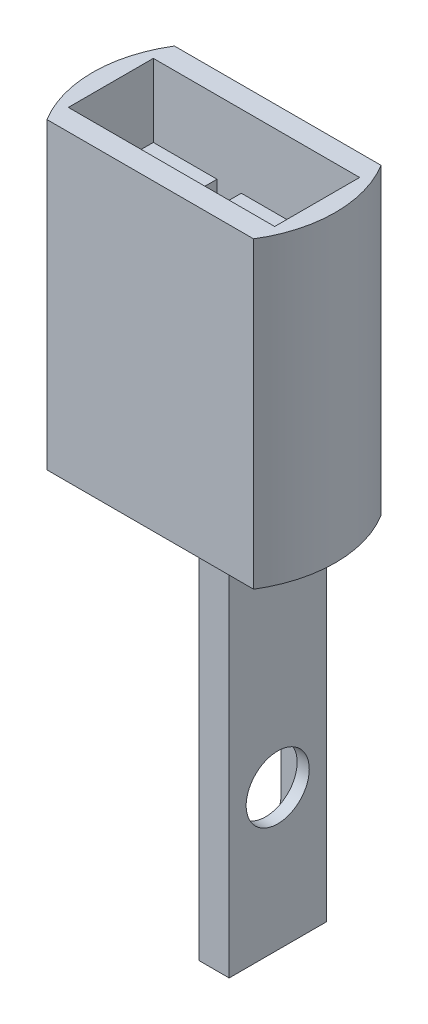
ISO-10303-21;
HEADER;
FILE_DESCRIPTION(('STEP AP214'),'2;1');
FILE_NAME('part.step','',(''),(''),'','','');
FILE_SCHEMA(('AUTOMOTIVE_DESIGN { 1 0 10303 214 1 1 1 1 }'));
ENDSEC;
DATA;
#1=APPLICATION_CONTEXT('core data for automotive mechanical design processes');
#2=APPLICATION_PROTOCOL_DEFINITION('international standard','automotive_design',2000,#1);
#3=PRODUCT_CONTEXT('',#1,'mechanical');
#4=PRODUCT('Part','Part','',(#3));
#5=PRODUCT_RELATED_PRODUCT_CATEGORY('part','',(#4));
#6=PRODUCT_DEFINITION_FORMATION('','',#4);
#7=PRODUCT_DEFINITION_CONTEXT('part definition',#1,'design');
#8=PRODUCT_DEFINITION('design','',#6,#7);
#9=PRODUCT_DEFINITION_SHAPE('','',#8);
#10=(LENGTH_UNIT() NAMED_UNIT(*) SI_UNIT(.MILLI.,.METRE.));
#11=(NAMED_UNIT(*) PLANE_ANGLE_UNIT() SI_UNIT($,.RADIAN.));
#12=(NAMED_UNIT(*) SI_UNIT($,.STERADIAN.) SOLID_ANGLE_UNIT());
#13=UNCERTAINTY_MEASURE_WITH_UNIT(LENGTH_MEASURE(1.E-05),#10,'distance_accuracy_value','');
#14=(GEOMETRIC_REPRESENTATION_CONTEXT(3) GLOBAL_UNCERTAINTY_ASSIGNED_CONTEXT((#13)) GLOBAL_UNIT_ASSIGNED_CONTEXT((#10,
#11,#12)) REPRESENTATION_CONTEXT('',''));
#15=CARTESIAN_POINT('',(0.,0.,0.));
#16=DIRECTION('',(0.,0.,1.));
#17=DIRECTION('',(1.,0.,0.));
#18=AXIS2_PLACEMENT_3D('',#15,#16,#17);
#19=CARTESIAN_POINT('',(0.,25.,0.));
#20=DIRECTION('',(0.,-1.,0.));
#21=DIRECTION('',(0.,0.,-1.));
#22=AXIS2_PLACEMENT_3D('',#19,#20,#21);
#23=CYLINDRICAL_SURFACE('',#22,10.);
#24=CARTESIAN_POINT('',(0.,25.,0.));
#25=DIRECTION('',(0.,1.,0.));
#26=DIRECTION('',(0.,0.,1.));
#27=AXIS2_PLACEMENT_3D('',#24,#25,#26);
#28=CIRCLE('',#27,10.);
#29=CARTESIAN_POINT('',(-8.5110222652746,25.,-5.25));
#30=VERTEX_POINT('',#29);
#31=CARTESIAN_POINT('',(-8.5110222652746,25.,5.25));
#32=VERTEX_POINT('',#31);
#33=EDGE_CURVE('E42',#30,#32,#28,.T.);
#34=ORIENTED_EDGE('',*,*,#33,.F.);
#35=DIRECTION('',(0.,-1.,0.));
#36=VECTOR('',#35,1.);
#37=CARTESIAN_POINT('',(-8.5110222652746,25.001,-5.25));
#38=LINE('',#37,#36);
#39=CARTESIAN_POINT('',(-8.5110222652746,0.,-5.25));
#40=VERTEX_POINT('',#39);
#41=EDGE_CURVE('E50',#30,#40,#38,.T.);
#42=ORIENTED_EDGE('',*,*,#41,.T.);
#43=CARTESIAN_POINT('',(0.,0.,0.));
#44=DIRECTION('',(0.,1.,0.));
#45=DIRECTION('',(0.,0.,1.));
#46=AXIS2_PLACEMENT_3D('',#43,#44,#45);
#47=CIRCLE('',#46,10.);
#48=CARTESIAN_POINT('',(-8.5110222652746,0.,5.25));
#49=VERTEX_POINT('',#48);
#50=EDGE_CURVE('E378',#40,#49,#47,.T.);
#51=ORIENTED_EDGE('',*,*,#50,.T.);
#52=DIRECTION('',(0.,-1.,0.));
#53=VECTOR('',#52,1.);
#54=CARTESIAN_POINT('',(-8.5110222652746,25.001,5.25));
#55=LINE('',#54,#53);
#56=EDGE_CURVE('E216',#32,#49,#55,.T.);
#57=ORIENTED_EDGE('',*,*,#56,.F.);
#58=EDGE_LOOP('',(#34,#42,#51,#57));
#59=FACE_BOUND('',#58,.T.);
#60=ADVANCED_FACE('F33',(#59),#23,.T.);
#61=CARTESIAN_POINT('',(4.25,0.,0.));
#62=DIRECTION('',(1.,0.,0.));
#63=DIRECTION('',(0.,0.,-1.));
#64=AXIS2_PLACEMENT_3D('',#61,#62,#63);
#65=PLANE('',#64);
#66=CARTESIAN_POINT('',(4.25,-18.4,0.));
#67=DIRECTION('',(1.,0.,0.));
#68=DIRECTION('',(0.,0.,-1.));
#69=AXIS2_PLACEMENT_3D('',#66,#67,#68);
#70=CIRCLE('',#69,2.6);
#71=CARTESIAN_POINT('',(4.25,-18.4,-2.6));
#72=VERTEX_POINT('',#71);
#73=EDGE_CURVE('E37',#72,#72,#70,.F.);
#74=ORIENTED_EDGE('',*,*,#73,.F.);
#75=EDGE_LOOP('',(#74));
#76=FACE_BOUND('',#75,.T.);
#77=DIRECTION('',(0.,0.984427575508482,0.175790638483658));
#78=VECTOR('',#77,1.);
#79=CARTESIAN_POINT('',(4.25,-14.9,-2.75));
#80=LINE('',#79,#78);
#81=CARTESIAN_POINT('',(4.25,-14.9,-2.75));
#82=VERTEX_POINT('',#81);
#83=CARTESIAN_POINT('',(4.25,-7.89999999999996,-1.5));
#84=VERTEX_POINT('',#83);
#85=EDGE_CURVE('E201',#82,#84,#80,.T.);
#86=ORIENTED_EDGE('',*,*,#85,.F.);
#87=DIRECTION('',(0.,-1.,0.));
#88=VECTOR('',#87,1.);
#89=CARTESIAN_POINT('',(4.25,-28.9,-2.75));
#90=LINE('',#89,#88);
#91=CARTESIAN_POINT('',(4.25,-21.9,-2.75));
#92=VERTEX_POINT('',#91);
#93=EDGE_CURVE('E332',#82,#92,#90,.T.);
#94=ORIENTED_EDGE('',*,*,#93,.T.);
#95=DIRECTION('',(0.,0.984427575508482,-0.175790638483658));
#96=VECTOR('',#95,1.);
#97=CARTESIAN_POINT('',(4.25,-21.9,-2.75));
#98=LINE('',#97,#96);
#99=CARTESIAN_POINT('',(4.25,-28.9,-1.5));
#100=VERTEX_POINT('',#99);
#101=EDGE_CURVE('E245',#100,#92,#98,.T.);
#102=ORIENTED_EDGE('',*,*,#101,.F.);
#103=DIRECTION('',(0.,0.,1.));
#104=VECTOR('',#103,1.);
#105=CARTESIAN_POINT('',(4.25,-28.9,-2.75));
#106=LINE('',#105,#104);
#107=CARTESIAN_POINT('',(4.25,-28.9,1.5));
#108=VERTEX_POINT('',#107);
#109=EDGE_CURVE('E334',#100,#108,#106,.T.);
#110=ORIENTED_EDGE('',*,*,#109,.T.);
#111=DIRECTION('',(0.,-0.984427575508482,-0.175790638483658));
#112=VECTOR('',#111,1.);
#113=CARTESIAN_POINT('',(4.25,-21.9,2.75));
#114=LINE('',#113,#112);
#115=CARTESIAN_POINT('',(4.25,-21.9,2.75));
#116=VERTEX_POINT('',#115);
#117=EDGE_CURVE('E234',#116,#108,#114,.T.);
#118=ORIENTED_EDGE('',*,*,#117,.F.);
#119=DIRECTION('',(0.,1.,0.));
#120=VECTOR('',#119,1.);
#121=CARTESIAN_POINT('',(4.25,-28.9,2.75));
#122=LINE('',#121,#120);
#123=CARTESIAN_POINT('',(4.25,-14.9,2.75));
#124=VERTEX_POINT('',#123);
#125=EDGE_CURVE('E325',#116,#124,#122,.T.);
#126=ORIENTED_EDGE('',*,*,#125,.T.);
#127=DIRECTION('',(0.,-0.984427575508482,0.175790638483658));
#128=VECTOR('',#127,1.);
#129=CARTESIAN_POINT('',(4.25,-14.9,2.75));
#130=LINE('',#129,#128);
#131=CARTESIAN_POINT('',(4.25,-7.89999999999996,1.5));
#132=VERTEX_POINT('',#131);
#133=EDGE_CURVE('E223',#132,#124,#130,.T.);
#134=ORIENTED_EDGE('',*,*,#133,.F.);
#135=DIRECTION('',(0.,0.,-1.));
#136=VECTOR('',#135,1.);
#137=CARTESIAN_POINT('',(4.25,-7.89999999999996,-2.75));
#138=LINE('',#137,#136);
#139=EDGE_CURVE('E328',#132,#84,#138,.T.);
#140=ORIENTED_EDGE('',*,*,#139,.T.);
#141=EDGE_LOOP('',(#86,#94,#102,#110,#118,#126,#134,#140));
#142=FACE_BOUND('',#141,.T.);
#143=ADVANCED_FACE('F402',(#76,#142),#65,.F.);
#144=CARTESIAN_POINT('',(4.25,-7.89999999999996,-2.75));
#145=DIRECTION('',(0.,1.,0.));
#146=DIRECTION('',(0.,0.,1.));
#147=AXIS2_PLACEMENT_3D('',#144,#145,#146);
#148=PLANE('',#147);
#149=DIRECTION('',(1.,0.,0.));
#150=VECTOR('',#149,1.);
#151=CARTESIAN_POINT('',(-4.36073132666395,-7.89999999999996,-1.5));
#152=LINE('',#151,#150);
#153=CARTESIAN_POINT('',(2.75,-7.89999999999996,-1.5));
#154=VERTEX_POINT('',#153);
#155=EDGE_CURVE('E224',#154,#84,#152,.T.);
#156=ORIENTED_EDGE('',*,*,#155,.T.);
#157=ORIENTED_EDGE('',*,*,#139,.F.);
#158=DIRECTION('',(1.,0.,0.));
#159=VECTOR('',#158,1.);
#160=CARTESIAN_POINT('',(-4.36073132666395,-7.89999999999996,1.5));
#161=LINE('',#160,#159);
#162=CARTESIAN_POINT('',(2.75,-7.89999999999996,1.5));
#163=VERTEX_POINT('',#162);
#164=EDGE_CURVE('E235',#163,#132,#161,.T.);
#165=ORIENTED_EDGE('',*,*,#164,.F.);
#166=DIRECTION('',(0.,0.,-1.));
#167=VECTOR('',#166,1.);
#168=CARTESIAN_POINT('',(2.75,-7.89999999999996,-2.75));
#169=LINE('',#168,#167);
#170=EDGE_CURVE('E338',#163,#154,#169,.T.);
#171=ORIENTED_EDGE('',*,*,#170,.T.);
#172=EDGE_LOOP('',(#156,#157,#165,#171));
#173=FACE_BOUND('',#172,.T.);
#174=ADVANCED_FACE('F406',(#173),#148,.F.);
#175=CARTESIAN_POINT('',(4.25,-28.9,-2.75));
#176=DIRECTION('',(0.,0.,-1.));
#177=DIRECTION('',(-1.,0.,0.));
#178=AXIS2_PLACEMENT_3D('',#175,#176,#177);
#179=PLANE('',#178);
#180=DIRECTION('',(1.,0.,0.));
#181=VECTOR('',#180,1.);
#182=CARTESIAN_POINT('',(-4.36073132666394,-14.9,-2.75));
#183=LINE('',#182,#181);
#184=CARTESIAN_POINT('',(2.75,-14.8999999999999,-2.75));
#185=VERTEX_POINT('',#184);
#186=EDGE_CURVE('E227',#185,#82,#183,.T.);
#187=ORIENTED_EDGE('',*,*,#186,.F.);
#188=DIRECTION('',(0.,-1.,0.));
#189=VECTOR('',#188,1.);
#190=CARTESIAN_POINT('',(2.75,-28.9,-2.75));
#191=LINE('',#190,#189);
#192=CARTESIAN_POINT('',(2.75,-21.9,-2.75));
#193=VERTEX_POINT('',#192);
#194=EDGE_CURVE('E340',#185,#193,#191,.T.);
#195=ORIENTED_EDGE('',*,*,#194,.T.);
#196=DIRECTION('',(1.,0.,0.));
#197=VECTOR('',#196,1.);
#198=CARTESIAN_POINT('',(-4.36073132666394,-21.9,-2.75));
#199=LINE('',#198,#197);
#200=EDGE_CURVE('E260',#193,#92,#199,.T.);
#201=ORIENTED_EDGE('',*,*,#200,.T.);
#202=ORIENTED_EDGE('',*,*,#93,.F.);
#203=EDGE_LOOP('',(#187,#195,#201,#202));
#204=FACE_BOUND('',#203,.T.);
#205=ADVANCED_FACE('F452',(#204),#179,.F.);
#206=CARTESIAN_POINT('',(4.25,-28.9,2.75));
#207=DIRECTION('',(0.,0.,1.));
#208=DIRECTION('',(1.,0.,0.));
#209=AXIS2_PLACEMENT_3D('',#206,#207,#208);
#210=PLANE('',#209);
#211=DIRECTION('',(1.,0.,0.));
#212=VECTOR('',#211,1.);
#213=CARTESIAN_POINT('',(-4.36073132666395,-14.9,2.75));
#214=LINE('',#213,#212);
#215=CARTESIAN_POINT('',(2.75,-14.8999999999999,2.75));
#216=VERTEX_POINT('',#215);
#217=EDGE_CURVE('E238',#216,#124,#214,.T.);
#218=ORIENTED_EDGE('',*,*,#217,.T.);
#219=ORIENTED_EDGE('',*,*,#125,.F.);
#220=DIRECTION('',(1.,0.,0.));
#221=VECTOR('',#220,1.);
#222=CARTESIAN_POINT('',(-4.36073132666395,-21.9,2.75));
#223=LINE('',#222,#221);
#224=CARTESIAN_POINT('',(2.75,-21.9,2.75));
#225=VERTEX_POINT('',#224);
#226=EDGE_CURVE('E249',#225,#116,#223,.T.);
#227=ORIENTED_EDGE('',*,*,#226,.F.);
#228=DIRECTION('',(0.,1.,0.));
#229=VECTOR('',#228,1.);
#230=CARTESIAN_POINT('',(2.75,-28.9,2.75));
#231=LINE('',#230,#229);
#232=EDGE_CURVE('E318',#225,#216,#231,.T.);
#233=ORIENTED_EDGE('',*,*,#232,.T.);
#234=EDGE_LOOP('',(#218,#219,#227,#233));
#235=FACE_BOUND('',#234,.T.);
#236=ADVANCED_FACE('F448',(#235),#210,.F.);
#237=CARTESIAN_POINT('',(4.25,-28.9,-2.75));
#238=DIRECTION('',(0.,-1.,0.));
#239=DIRECTION('',(0.,0.,-1.));
#240=AXIS2_PLACEMENT_3D('',#237,#238,#239);
#241=PLANE('',#240);
#242=DIRECTION('',(1.,0.,0.));
#243=VECTOR('',#242,1.);
#244=CARTESIAN_POINT('',(-4.36073132666395,-28.9,1.5));
#245=LINE('',#244,#243);
#246=CARTESIAN_POINT('',(2.75,-28.9,1.5));
#247=VERTEX_POINT('',#246);
#248=EDGE_CURVE('E246',#247,#108,#245,.T.);
#249=ORIENTED_EDGE('',*,*,#248,.T.);
#250=ORIENTED_EDGE('',*,*,#109,.F.);
#251=DIRECTION('',(1.,0.,0.));
#252=VECTOR('',#251,1.);
#253=CARTESIAN_POINT('',(-4.36073132666395,-28.9,-1.5));
#254=LINE('',#253,#252);
#255=CARTESIAN_POINT('',(2.75,-28.9,-1.5));
#256=VERTEX_POINT('',#255);
#257=EDGE_CURVE('E257',#256,#100,#254,.T.);
#258=ORIENTED_EDGE('',*,*,#257,.F.);
#259=DIRECTION('',(0.,0.,1.));
#260=VECTOR('',#259,1.);
#261=CARTESIAN_POINT('',(2.75,-28.9,-2.75));
#262=LINE('',#261,#260);
#263=EDGE_CURVE('E329',#256,#247,#262,.T.);
#264=ORIENTED_EDGE('',*,*,#263,.T.);
#265=EDGE_LOOP('',(#249,#250,#258,#264));
#266=FACE_BOUND('',#265,.T.);
#267=ADVANCED_FACE('F451',(#266),#241,.F.);
#268=CARTESIAN_POINT('',(0.,19.,0.));
#269=DIRECTION('',(0.,-1.,0.));
#270=DIRECTION('',(0.,0.,-1.));
#271=AXIS2_PLACEMENT_3D('',#268,#269,#270);
#272=PLANE('',#271);
#273=DIRECTION('',(0.,0.,-1.));
#274=VECTOR('',#273,1.);
#275=CARTESIAN_POINT('',(-1.25,19.,-3.5));
#276=LINE('',#275,#274);
#277=CARTESIAN_POINT('',(-1.25,19.,3.5));
#278=VERTEX_POINT('',#277);
#279=CARTESIAN_POINT('',(-1.25,19.,-3.5));
#280=VERTEX_POINT('',#279);
#281=EDGE_CURVE('E256',#278,#280,#276,.T.);
#282=ORIENTED_EDGE('',*,*,#281,.F.);
#283=DIRECTION('',(1.,0.,0.));
#284=VECTOR('',#283,1.);
#285=CARTESIAN_POINT('',(-8.5,19.,3.5));
#286=LINE('',#285,#284);
#287=CARTESIAN_POINT('',(8.5,19.,3.5));
#288=VERTEX_POINT('',#287);
#289=EDGE_CURVE('E294',#278,#288,#286,.T.);
#290=ORIENTED_EDGE('',*,*,#289,.T.);
#291=DIRECTION('',(0.,0.,-1.));
#292=VECTOR('',#291,1.);
#293=CARTESIAN_POINT('',(8.5,19.,3.5));
#294=LINE('',#293,#292);
#295=CARTESIAN_POINT('',(8.5,19.,-3.5));
#296=VERTEX_POINT('',#295);
#297=EDGE_CURVE('E299',#288,#296,#294,.T.);
#298=ORIENTED_EDGE('',*,*,#297,.T.);
#299=DIRECTION('',(-1.,0.,0.));
#300=VECTOR('',#299,1.);
#301=CARTESIAN_POINT('',(-8.5,19.,-3.5));
#302=LINE('',#301,#300);
#303=EDGE_CURVE('E303',#296,#280,#302,.T.);
#304=ORIENTED_EDGE('',*,*,#303,.T.);
#305=EDGE_LOOP('',(#282,#290,#298,#304));
#306=FACE_BOUND('',#305,.T.);
#307=ADVANCED_FACE('F420',(#306),#272,.F.);
#308=DIRECTION('',(0.,0.,1.));
#309=VECTOR('',#308,1.);
#310=CARTESIAN_POINT('',(-3.25,19.,-3.5));
#311=LINE('',#310,#309);
#312=CARTESIAN_POINT('',(-3.25,19.,-3.5));
#313=VERTEX_POINT('',#312);
#314=CARTESIAN_POINT('',(-3.25,19.,3.5));
#315=VERTEX_POINT('',#314);
#316=EDGE_CURVE('E269',#313,#315,#311,.T.);
#317=ORIENTED_EDGE('',*,*,#316,.F.);
#318=CARTESIAN_POINT('',(-8.5,19.,-3.5));
#319=VERTEX_POINT('',#318);
#320=EDGE_CURVE('E302',#313,#319,#302,.T.);
#321=ORIENTED_EDGE('',*,*,#320,.T.);
#322=DIRECTION('',(0.,0.,1.));
#323=VECTOR('',#322,1.);
#324=CARTESIAN_POINT('',(-8.5,19.,3.5));
#325=LINE('',#324,#323);
#326=CARTESIAN_POINT('',(-8.5,19.,3.5));
#327=VERTEX_POINT('',#326);
#328=EDGE_CURVE('E291',#319,#327,#325,.T.);
#329=ORIENTED_EDGE('',*,*,#328,.T.);
#330=EDGE_CURVE('E296',#327,#315,#286,.T.);
#331=ORIENTED_EDGE('',*,*,#330,.T.);
#332=EDGE_LOOP('',(#317,#321,#329,#331));
#333=FACE_BOUND('',#332,.T.);
#334=ADVANCED_FACE('F416',(#333),#272,.F.);
#335=CARTESIAN_POINT('',(0.,0.,0.));
#336=DIRECTION('',(0.,1.,0.));
#337=DIRECTION('',(0.,0.,1.));
#338=AXIS2_PLACEMENT_3D('',#335,#336,#337);
#339=PLANE('',#338);
#340=ORIENTED_EDGE('',*,*,#50,.F.);
#341=DIRECTION('',(-1.,0.,0.));
#342=VECTOR('',#341,1.);
#343=CARTESIAN_POINT('',(-8.5110222652746,0.,-5.25));
#344=LINE('',#343,#342);
#345=CARTESIAN_POINT('',(8.5110222652746,0.,-5.25));
#346=VERTEX_POINT('',#345);
#347=EDGE_CURVE('E208',#346,#40,#344,.T.);
#348=ORIENTED_EDGE('',*,*,#347,.F.);
#349=CARTESIAN_POINT('',(8.5110222652746,0.,5.25));
#350=VERTEX_POINT('',#349);
#351=EDGE_CURVE('E207',#350,#346,#47,.T.);
#352=ORIENTED_EDGE('',*,*,#351,.F.);
#353=DIRECTION('',(1.,0.,0.));
#354=VECTOR('',#353,1.);
#355=CARTESIAN_POINT('',(-8.5110222652746,0.,5.25));
#356=LINE('',#355,#354);
#357=EDGE_CURVE('E386',#49,#350,#356,.T.);
#358=ORIENTED_EDGE('',*,*,#357,.F.);
#359=EDGE_LOOP('',(#340,#348,#352,#358));
#360=FACE_BOUND('',#359,.T.);
#361=DIRECTION('',(0.,0.,1.));
#362=VECTOR('',#361,1.);
#363=CARTESIAN_POINT('',(5.25,0.,-4.));
#364=LINE('',#363,#362);
#365=CARTESIAN_POINT('',(5.25,0.,-4.));
#366=VERTEX_POINT('',#365);
#367=CARTESIAN_POINT('',(5.25,0.,4.));
#368=VERTEX_POINT('',#367);
#369=EDGE_CURVE('E346',#366,#368,#364,.T.);
#370=ORIENTED_EDGE('',*,*,#369,.F.);
#371=DIRECTION('',(1.,0.,0.));
#372=VECTOR('',#371,1.);
#373=CARTESIAN_POINT('',(2.75,0.,-4.));
#374=LINE('',#373,#372);
#375=CARTESIAN_POINT('',(2.75,0.,-4.));
#376=VERTEX_POINT('',#375);
#377=EDGE_CURVE('E351',#376,#366,#374,.T.);
#378=ORIENTED_EDGE('',*,*,#377,.F.);
#379=DIRECTION('',(0.,0.,-1.));
#380=VECTOR('',#379,1.);
#381=CARTESIAN_POINT('',(2.75,0.,-4.));
#382=LINE('',#381,#380);
#383=CARTESIAN_POINT('',(2.75,0.,4.));
#384=VERTEX_POINT('',#383);
#385=EDGE_CURVE('E363',#384,#376,#382,.T.);
#386=ORIENTED_EDGE('',*,*,#385,.F.);
#387=DIRECTION('',(-1.,0.,0.));
#388=VECTOR('',#387,1.);
#389=CARTESIAN_POINT('',(2.75,0.,4.));
#390=LINE('',#389,#388);
#391=EDGE_CURVE('E360',#368,#384,#390,.T.);
#392=ORIENTED_EDGE('',*,*,#391,.F.);
#393=EDGE_LOOP('',(#370,#378,#386,#392));
#394=FACE_BOUND('',#393,.T.);
#395=ADVANCED_FACE('F384',(#360,#394),#339,.F.);
#396=ORIENTED_EDGE('',*,*,#351,.T.);
#397=DIRECTION('',(0.,-1.,0.));
#398=VECTOR('',#397,1.);
#399=CARTESIAN_POINT('',(8.5110222652746,25.001,-5.25));
#400=LINE('',#399,#398);
#401=CARTESIAN_POINT('',(8.5110222652746,25.,-5.25));
#402=VERTEX_POINT('',#401);
#403=EDGE_CURVE('E196',#402,#346,#400,.T.);
#404=ORIENTED_EDGE('',*,*,#403,.F.);
#405=CARTESIAN_POINT('',(8.5110222652746,25.,5.25));
#406=VERTEX_POINT('',#405);
#407=EDGE_CURVE('E11',#406,#402,#28,.T.);
#408=ORIENTED_EDGE('',*,*,#407,.F.);
#409=DIRECTION('',(0.,-1.,0.));
#410=VECTOR('',#409,1.);
#411=CARTESIAN_POINT('',(8.5110222652746,25.001,5.25));
#412=LINE('',#411,#410);
#413=EDGE_CURVE('E58',#406,#350,#412,.T.);
#414=ORIENTED_EDGE('',*,*,#413,.T.);
#415=EDGE_LOOP('',(#396,#404,#408,#414));
#416=FACE_BOUND('',#415,.T.);
#417=ADVANCED_FACE('F35',(#416),#23,.T.);
#418=CARTESIAN_POINT('',(0.,25.,0.));
#419=DIRECTION('',(0.,1.,0.));
#420=DIRECTION('',(0.,0.,1.));
#421=AXIS2_PLACEMENT_3D('',#418,#419,#420);
#422=PLANE('',#421);
#423=DIRECTION('',(-1.,0.,0.));
#424=VECTOR('',#423,1.);
#425=CARTESIAN_POINT('',(-8.5110222652746,25.,-5.25));
#426=LINE('',#425,#424);
#427=EDGE_CURVE('E193',#402,#30,#426,.T.);
#428=ORIENTED_EDGE('',*,*,#427,.T.);
#429=ORIENTED_EDGE('',*,*,#33,.T.);
#430=DIRECTION('',(1.,0.,0.));
#431=VECTOR('',#430,1.);
#432=CARTESIAN_POINT('',(-8.5110222652746,25.,5.25));
#433=LINE('',#432,#431);
#434=EDGE_CURVE('E212',#32,#406,#433,.T.);
#435=ORIENTED_EDGE('',*,*,#434,.T.);
#436=ORIENTED_EDGE('',*,*,#407,.T.);
#437=EDGE_LOOP('',(#428,#429,#435,#436));
#438=FACE_BOUND('',#437,.T.);
#439=DIRECTION('',(0.,0.,1.));
#440=VECTOR('',#439,1.);
#441=CARTESIAN_POINT('',(-8.5,25.,3.5));
#442=LINE('',#441,#440);
#443=CARTESIAN_POINT('',(-8.5,25.,-3.5));
#444=VERTEX_POINT('',#443);
#445=CARTESIAN_POINT('',(-8.5,25.,3.5));
#446=VERTEX_POINT('',#445);
#447=EDGE_CURVE('E285',#444,#446,#442,.T.);
#448=ORIENTED_EDGE('',*,*,#447,.F.);
#449=DIRECTION('',(-1.,0.,0.));
#450=VECTOR('',#449,1.);
#451=CARTESIAN_POINT('',(-8.5,25.,-3.5));
#452=LINE('',#451,#450);
#453=CARTESIAN_POINT('',(8.5,25.,-3.5));
#454=VERTEX_POINT('',#453);
#455=EDGE_CURVE('E295',#454,#444,#452,.T.);
#456=ORIENTED_EDGE('',*,*,#455,.F.);
#457=DIRECTION('',(0.,0.,-1.));
#458=VECTOR('',#457,1.);
#459=CARTESIAN_POINT('',(8.5,25.,3.5));
#460=LINE('',#459,#458);
#461=CARTESIAN_POINT('',(8.5,25.,3.5));
#462=VERTEX_POINT('',#461);
#463=EDGE_CURVE('E311',#462,#454,#460,.T.);
#464=ORIENTED_EDGE('',*,*,#463,.F.);
#465=DIRECTION('',(1.,0.,0.));
#466=VECTOR('',#465,1.);
#467=CARTESIAN_POINT('',(-8.5,25.,3.5));
#468=LINE('',#467,#466);
#469=EDGE_CURVE('E308',#446,#462,#468,.T.);
#470=ORIENTED_EDGE('',*,*,#469,.F.);
#471=EDGE_LOOP('',(#448,#456,#464,#470));
#472=FACE_BOUND('',#471,.T.);
#473=ADVANCED_FACE('F210',(#438,#472),#422,.T.);
#474=CARTESIAN_POINT('',(5.25,-30.,-4.));
#475=DIRECTION('',(-1.,0.,0.));
#476=DIRECTION('',(0.,0.,1.));
#477=AXIS2_PLACEMENT_3D('',#474,#475,#476);
#478=PLANE('',#477);
#479=CARTESIAN_POINT('',(5.25,-18.4,0.));
#480=DIRECTION('',(1.,0.,0.));
#481=DIRECTION('',(0.,0.,-1.));
#482=AXIS2_PLACEMENT_3D('',#479,#480,#481);
#483=CIRCLE('',#482,2.6);
#484=CARTESIAN_POINT('',(5.25,-18.4,-2.6));
#485=VERTEX_POINT('',#484);
#486=EDGE_CURVE('E343',#485,#485,#483,.T.);
#487=ORIENTED_EDGE('',*,*,#486,.F.);
#488=EDGE_LOOP('',(#487));
#489=FACE_BOUND('',#488,.T.);
#490=ORIENTED_EDGE('',*,*,#369,.T.);
#491=DIRECTION('',(0.,1.,0.));
#492=VECTOR('',#491,1.);
#493=CARTESIAN_POINT('',(5.25,-30.,4.));
#494=LINE('',#493,#492);
#495=CARTESIAN_POINT('',(5.25,-30.,4.));
#496=VERTEX_POINT('',#495);
#497=EDGE_CURVE('E376',#496,#368,#494,.T.);
#498=ORIENTED_EDGE('',*,*,#497,.F.);
#499=DIRECTION('',(0.,0.,1.));
#500=VECTOR('',#499,1.);
#501=CARTESIAN_POINT('',(5.25,-30.,-4.));
#502=LINE('',#501,#500);
#503=CARTESIAN_POINT('',(5.25,-30.,-4.));
#504=VERTEX_POINT('',#503);
#505=EDGE_CURVE('E347',#504,#496,#502,.T.);
#506=ORIENTED_EDGE('',*,*,#505,.F.);
#507=DIRECTION('',(0.,1.,0.));
#508=VECTOR('',#507,1.);
#509=CARTESIAN_POINT('',(5.25,-30.,-4.));
#510=LINE('',#509,#508);
#511=EDGE_CURVE('E357',#504,#366,#510,.T.);
#512=ORIENTED_EDGE('',*,*,#511,.T.);
#513=EDGE_LOOP('',(#490,#498,#506,#512));
#514=FACE_BOUND('',#513,.T.);
#515=ADVANCED_FACE('F414',(#489,#514),#478,.F.);
#516=CARTESIAN_POINT('',(2.75,-30.,4.));
#517=DIRECTION('',(0.,0.,-1.));
#518=DIRECTION('',(-1.,0.,0.));
#519=AXIS2_PLACEMENT_3D('',#516,#517,#518);
#520=PLANE('',#519);
#521=ORIENTED_EDGE('',*,*,#391,.T.);
#522=DIRECTION('',(0.,1.,0.));
#523=VECTOR('',#522,1.);
#524=CARTESIAN_POINT('',(2.75,-30.,4.));
#525=LINE('',#524,#523);
#526=CARTESIAN_POINT('',(2.75,-30.,4.));
#527=VERTEX_POINT('',#526);
#528=EDGE_CURVE('E373',#527,#384,#525,.T.);
#529=ORIENTED_EDGE('',*,*,#528,.F.);
#530=DIRECTION('',(-1.,0.,0.));
#531=VECTOR('',#530,1.);
#532=CARTESIAN_POINT('',(2.75,-30.,4.));
#533=LINE('',#532,#531);
#534=EDGE_CURVE('E350',#496,#527,#533,.T.);
#535=ORIENTED_EDGE('',*,*,#534,.F.);
#536=ORIENTED_EDGE('',*,*,#497,.T.);
#537=EDGE_LOOP('',(#521,#529,#535,#536));
#538=FACE_BOUND('',#537,.T.);
#539=ADVANCED_FACE('F426',(#538),#520,.F.);
#540=CARTESIAN_POINT('',(2.75,-30.,-4.));
#541=DIRECTION('',(1.,0.,0.));
#542=DIRECTION('',(0.,0.,-1.));
#543=AXIS2_PLACEMENT_3D('',#540,#541,#542);
#544=PLANE('',#543);
#545=ORIENTED_EDGE('',*,*,#194,.F.);
#546=DIRECTION('',(0.,-0.984427575508482,-0.175790638483658));
#547=VECTOR('',#546,1.);
#548=CARTESIAN_POINT('',(2.75,-14.9,-2.75));
#549=LINE('',#548,#547);
#550=EDGE_CURVE('E220',#154,#185,#549,.T.);
#551=ORIENTED_EDGE('',*,*,#550,.F.);
#552=ORIENTED_EDGE('',*,*,#170,.F.);
#553=DIRECTION('',(0.,0.984427575508482,-0.175790638483658));
#554=VECTOR('',#553,1.);
#555=CARTESIAN_POINT('',(2.75,-14.9,2.75));
#556=LINE('',#555,#554);
#557=EDGE_CURVE('E231',#216,#163,#556,.T.);
#558=ORIENTED_EDGE('',*,*,#557,.F.);
#559=ORIENTED_EDGE('',*,*,#232,.F.);
#560=DIRECTION('',(0.,0.984427575508482,0.175790638483658));
#561=VECTOR('',#560,1.);
#562=CARTESIAN_POINT('',(2.75,-21.9,2.75));
#563=LINE('',#562,#561);
#564=EDGE_CURVE('E242',#247,#225,#563,.T.);
#565=ORIENTED_EDGE('',*,*,#564,.F.);
#566=ORIENTED_EDGE('',*,*,#263,.F.);
#567=DIRECTION('',(0.,-0.984427575508482,0.175790638483658));
#568=VECTOR('',#567,1.);
#569=CARTESIAN_POINT('',(2.75,-21.9,-2.75));
#570=LINE('',#569,#568);
#571=EDGE_CURVE('E253',#193,#256,#570,.T.);
#572=ORIENTED_EDGE('',*,*,#571,.F.);
#573=EDGE_LOOP('',(#545,#551,#552,#558,#559,#565,#566,#572));
#574=FACE_BOUND('',#573,.T.);
#575=ORIENTED_EDGE('',*,*,#385,.T.);
#576=DIRECTION('',(0.,1.,0.));
#577=VECTOR('',#576,1.);
#578=CARTESIAN_POINT('',(2.75,-30.,-4.));
#579=LINE('',#578,#577);
#580=CARTESIAN_POINT('',(2.75,-30.,-4.));
#581=VERTEX_POINT('',#580);
#582=EDGE_CURVE('E370',#581,#376,#579,.T.);
#583=ORIENTED_EDGE('',*,*,#582,.F.);
#584=DIRECTION('',(0.,0.,-1.));
#585=VECTOR('',#584,1.);
#586=CARTESIAN_POINT('',(2.75,-30.,-4.));
#587=LINE('',#586,#585);
#588=EDGE_CURVE('E353',#527,#581,#587,.T.);
#589=ORIENTED_EDGE('',*,*,#588,.F.);
#590=ORIENTED_EDGE('',*,*,#528,.T.);
#591=EDGE_LOOP('',(#575,#583,#589,#590));
#592=FACE_BOUND('',#591,.T.);
#593=ADVANCED_FACE('F430',(#574,#592),#544,.F.);
#594=CARTESIAN_POINT('',(2.75,-30.,-4.));
#595=DIRECTION('',(0.,0.,1.));
#596=DIRECTION('',(1.,0.,0.));
#597=AXIS2_PLACEMENT_3D('',#594,#595,#596);
#598=PLANE('',#597);
#599=ORIENTED_EDGE('',*,*,#377,.T.);
#600=ORIENTED_EDGE('',*,*,#511,.F.);
#601=DIRECTION('',(1.,0.,0.));
#602=VECTOR('',#601,1.);
#603=CARTESIAN_POINT('',(2.75,-30.,-4.));
#604=LINE('',#603,#602);
#605=EDGE_CURVE('E355',#581,#504,#604,.T.);
#606=ORIENTED_EDGE('',*,*,#605,.F.);
#607=ORIENTED_EDGE('',*,*,#582,.T.);
#608=EDGE_LOOP('',(#599,#600,#606,#607));
#609=FACE_BOUND('',#608,.T.);
#610=ADVANCED_FACE('F434',(#609),#598,.F.);
#611=CARTESIAN_POINT('',(0.,-30.,0.));
#612=DIRECTION('',(0.,1.,0.));
#613=DIRECTION('',(0.,0.,1.));
#614=AXIS2_PLACEMENT_3D('',#611,#612,#613);
#615=PLANE('',#614);
#616=ORIENTED_EDGE('',*,*,#505,.T.);
#617=ORIENTED_EDGE('',*,*,#534,.T.);
#618=ORIENTED_EDGE('',*,*,#588,.T.);
#619=ORIENTED_EDGE('',*,*,#605,.T.);
#620=EDGE_LOOP('',(#616,#617,#618,#619));
#621=FACE_BOUND('',#620,.T.);
#622=ADVANCED_FACE('F438',(#621),#615,.F.);
#623=CARTESIAN_POINT('',(-10.001,-18.4,0.));
#624=DIRECTION('',(1.,0.,0.));
#625=DIRECTION('',(0.,0.,-1.));
#626=AXIS2_PLACEMENT_3D('',#623,#624,#625);
#627=CYLINDRICAL_SURFACE('',#626,2.6);
#628=ORIENTED_EDGE('',*,*,#73,.T.);
#629=EDGE_LOOP('',(#628));
#630=FACE_BOUND('',#629,.T.);
#631=ORIENTED_EDGE('',*,*,#486,.T.);
#632=EDGE_LOOP('',(#631));
#633=FACE_BOUND('',#632,.T.);
#634=ADVANCED_FACE('F442',(#630,#633),#627,.F.);
#635=CARTESIAN_POINT('',(-8.5,19.,3.5));
#636=DIRECTION('',(-1.,0.,0.));
#637=DIRECTION('',(0.,0.,1.));
#638=AXIS2_PLACEMENT_3D('',#635,#636,#637);
#639=PLANE('',#638);
#640=ORIENTED_EDGE('',*,*,#447,.T.);
#641=DIRECTION('',(0.,1.,0.));
#642=VECTOR('',#641,1.);
#643=CARTESIAN_POINT('',(-8.5,19.,3.5));
#644=LINE('',#643,#642);
#645=EDGE_CURVE('E306',#327,#446,#644,.T.);
#646=ORIENTED_EDGE('',*,*,#645,.F.);
#647=ORIENTED_EDGE('',*,*,#328,.F.);
#648=DIRECTION('',(0.,1.,0.));
#649=VECTOR('',#648,1.);
#650=CARTESIAN_POINT('',(-8.5,19.,-3.5));
#651=LINE('',#650,#649);
#652=EDGE_CURVE('E316',#319,#444,#651,.T.);
#653=ORIENTED_EDGE('',*,*,#652,.T.);
#654=EDGE_LOOP('',(#640,#646,#647,#653));
#655=FACE_BOUND('',#654,.T.);
#656=ADVANCED_FACE('F446',(#655),#639,.F.);
#657=CARTESIAN_POINT('',(-8.5,19.,-3.5));
#658=DIRECTION('',(0.,0.,-1.));
#659=DIRECTION('',(-1.,0.,0.));
#660=AXIS2_PLACEMENT_3D('',#657,#658,#659);
#661=PLANE('',#660);
#662=ORIENTED_EDGE('',*,*,#455,.T.);
#663=ORIENTED_EDGE('',*,*,#652,.F.);
#664=ORIENTED_EDGE('',*,*,#320,.F.);
#665=DIRECTION('',(0.,1.,0.));
#666=VECTOR('',#665,1.);
#667=CARTESIAN_POINT('',(-3.25,15.,-3.5));
#668=LINE('',#667,#666);
#669=CARTESIAN_POINT('',(-3.25,15.,-3.5));
#670=VERTEX_POINT('',#669);
#671=EDGE_CURVE('E288',#670,#313,#668,.T.);
#672=ORIENTED_EDGE('',*,*,#671,.F.);
#673=DIRECTION('',(-1.,0.,0.));
#674=VECTOR('',#673,1.);
#675=CARTESIAN_POINT('',(-1.25,15.,-3.5));
#676=LINE('',#675,#674);
#677=CARTESIAN_POINT('',(-1.25,15.,-3.5));
#678=VERTEX_POINT('',#677);
#679=EDGE_CURVE('E268',#678,#670,#676,.T.);
#680=ORIENTED_EDGE('',*,*,#679,.F.);
#681=DIRECTION('',(0.,1.,0.));
#682=VECTOR('',#681,1.);
#683=CARTESIAN_POINT('',(-1.25,15.,-3.5));
#684=LINE('',#683,#682);
#685=EDGE_CURVE('E278',#678,#280,#684,.T.);
#686=ORIENTED_EDGE('',*,*,#685,.T.);
#687=ORIENTED_EDGE('',*,*,#303,.F.);
#688=DIRECTION('',(0.,1.,0.));
#689=VECTOR('',#688,1.);
#690=CARTESIAN_POINT('',(8.5,19.,-3.5));
#691=LINE('',#690,#689);
#692=EDGE_CURVE('E319',#296,#454,#691,.T.);
#693=ORIENTED_EDGE('',*,*,#692,.T.);
#694=EDGE_LOOP('',(#662,#663,#664,#672,#680,#686,#687,#693));
#695=FACE_BOUND('',#694,.T.);
#696=ADVANCED_FACE('F465',(#695),#661,.F.);
#697=CARTESIAN_POINT('',(8.5,19.,3.5));
#698=DIRECTION('',(1.,0.,0.));
#699=DIRECTION('',(0.,0.,-1.));
#700=AXIS2_PLACEMENT_3D('',#697,#698,#699);
#701=PLANE('',#700);
#702=ORIENTED_EDGE('',*,*,#463,.T.);
#703=ORIENTED_EDGE('',*,*,#692,.F.);
#704=ORIENTED_EDGE('',*,*,#297,.F.);
#705=DIRECTION('',(0.,1.,0.));
#706=VECTOR('',#705,1.);
#707=CARTESIAN_POINT('',(8.5,19.,3.5));
#708=LINE('',#707,#706);
#709=EDGE_CURVE('E321',#288,#462,#708,.T.);
#710=ORIENTED_EDGE('',*,*,#709,.T.);
#711=EDGE_LOOP('',(#702,#703,#704,#710));
#712=FACE_BOUND('',#711,.T.);
#713=ADVANCED_FACE('F471',(#712),#701,.F.);
#714=CARTESIAN_POINT('',(-8.5,19.,3.5));
#715=DIRECTION('',(0.,0.,1.));
#716=DIRECTION('',(1.,0.,0.));
#717=AXIS2_PLACEMENT_3D('',#714,#715,#716);
#718=PLANE('',#717);
#719=ORIENTED_EDGE('',*,*,#469,.T.);
#720=ORIENTED_EDGE('',*,*,#709,.F.);
#721=ORIENTED_EDGE('',*,*,#289,.F.);
#722=DIRECTION('',(0.,1.,0.));
#723=VECTOR('',#722,1.);
#724=CARTESIAN_POINT('',(-1.25,15.,3.5));
#725=LINE('',#724,#723);
#726=CARTESIAN_POINT('',(-1.25,15.,3.5));
#727=VERTEX_POINT('',#726);
#728=EDGE_CURVE('E283',#727,#278,#725,.T.);
#729=ORIENTED_EDGE('',*,*,#728,.F.);
#730=DIRECTION('',(1.,0.,0.));
#731=VECTOR('',#730,1.);
#732=CARTESIAN_POINT('',(-1.25,15.,3.5));
#733=LINE('',#732,#731);
#734=CARTESIAN_POINT('',(-3.25,15.,3.5));
#735=VERTEX_POINT('',#734);
#736=EDGE_CURVE('E275',#735,#727,#733,.T.);
#737=ORIENTED_EDGE('',*,*,#736,.F.);
#738=DIRECTION('',(0.,1.,0.));
#739=VECTOR('',#738,1.);
#740=CARTESIAN_POINT('',(-3.25,15.,3.5));
#741=LINE('',#740,#739);
#742=EDGE_CURVE('E286',#735,#315,#741,.T.);
#743=ORIENTED_EDGE('',*,*,#742,.T.);
#744=ORIENTED_EDGE('',*,*,#330,.F.);
#745=ORIENTED_EDGE('',*,*,#645,.T.);
#746=EDGE_LOOP('',(#719,#720,#721,#729,#737,#743,#744,#745));
#747=FACE_BOUND('',#746,.T.);
#748=ADVANCED_FACE('F467',(#747),#718,.F.);
#749=CARTESIAN_POINT('',(-1.25,15.,-3.5));
#750=DIRECTION('',(1.,0.,0.));
#751=DIRECTION('',(0.,0.,-1.));
#752=AXIS2_PLACEMENT_3D('',#749,#750,#751);
#753=PLANE('',#752);
#754=ORIENTED_EDGE('',*,*,#281,.T.);
#755=ORIENTED_EDGE('',*,*,#685,.F.);
#756=DIRECTION('',(0.,0.,-1.));
#757=VECTOR('',#756,1.);
#758=CARTESIAN_POINT('',(-1.25,15.,-3.5));
#759=LINE('',#758,#757);
#760=EDGE_CURVE('E265',#727,#678,#759,.T.);
#761=ORIENTED_EDGE('',*,*,#760,.F.);
#762=ORIENTED_EDGE('',*,*,#728,.T.);
#763=EDGE_LOOP('',(#754,#755,#761,#762));
#764=FACE_BOUND('',#763,.T.);
#765=ADVANCED_FACE('F470',(#764),#753,.F.);
#766=CARTESIAN_POINT('',(-3.25,15.,-3.5));
#767=DIRECTION('',(-1.,0.,0.));
#768=DIRECTION('',(0.,0.,1.));
#769=AXIS2_PLACEMENT_3D('',#766,#767,#768);
#770=PLANE('',#769);
#771=ORIENTED_EDGE('',*,*,#316,.T.);
#772=ORIENTED_EDGE('',*,*,#742,.F.);
#773=DIRECTION('',(0.,0.,1.));
#774=VECTOR('',#773,1.);
#775=CARTESIAN_POINT('',(-3.25,15.,-3.5));
#776=LINE('',#775,#774);
#777=EDGE_CURVE('E272',#670,#735,#776,.T.);
#778=ORIENTED_EDGE('',*,*,#777,.F.);
#779=ORIENTED_EDGE('',*,*,#671,.T.);
#780=EDGE_LOOP('',(#771,#772,#778,#779));
#781=FACE_BOUND('',#780,.T.);
#782=ADVANCED_FACE('F483',(#781),#770,.F.);
#783=CARTESIAN_POINT('',(0.,15.,0.));
#784=DIRECTION('',(0.,-1.,0.));
#785=DIRECTION('',(0.,0.,-1.));
#786=AXIS2_PLACEMENT_3D('',#783,#784,#785);
#787=PLANE('',#786);
#788=ORIENTED_EDGE('',*,*,#760,.T.);
#789=ORIENTED_EDGE('',*,*,#679,.T.);
#790=ORIENTED_EDGE('',*,*,#777,.T.);
#791=ORIENTED_EDGE('',*,*,#736,.T.);
#792=EDGE_LOOP('',(#788,#789,#790,#791));
#793=FACE_BOUND('',#792,.T.);
#794=ADVANCED_FACE('F487',(#793),#787,.F.);
#795=CARTESIAN_POINT('',(-4.36073132666394,-21.9,-2.75));
#796=DIRECTION('',(0.,-0.175790638483658,-0.984427575508482));
#797=DIRECTION('',(0.,0.984427575508482,-0.175790638483658));
#798=AXIS2_PLACEMENT_3D('',#795,#796,#797);
#799=PLANE('',#798);
#800=ORIENTED_EDGE('',*,*,#200,.F.);
#801=ORIENTED_EDGE('',*,*,#571,.T.);
#802=ORIENTED_EDGE('',*,*,#257,.T.);
#803=ORIENTED_EDGE('',*,*,#101,.T.);
#804=EDGE_LOOP('',(#800,#801,#802,#803));
#805=FACE_BOUND('',#804,.T.);
#806=ADVANCED_FACE('F491',(#805),#799,.F.);
#807=CARTESIAN_POINT('',(-4.36073132666395,-21.9,2.75));
#808=DIRECTION('',(0.,-0.175790638483658,0.984427575508482));
#809=DIRECTION('',(0.,-0.984427575508482,-0.175790638483658));
#810=AXIS2_PLACEMENT_3D('',#807,#808,#809);
#811=PLANE('',#810);
#812=ORIENTED_EDGE('',*,*,#248,.F.);
#813=ORIENTED_EDGE('',*,*,#564,.T.);
#814=ORIENTED_EDGE('',*,*,#226,.T.);
#815=ORIENTED_EDGE('',*,*,#117,.T.);
#816=EDGE_LOOP('',(#812,#813,#814,#815));
#817=FACE_BOUND('',#816,.T.);
#818=ADVANCED_FACE('F495',(#817),#811,.F.);
#819=CARTESIAN_POINT('',(-4.36073132666395,-14.9,2.75));
#820=DIRECTION('',(0.,0.175790638483658,0.984427575508482));
#821=DIRECTION('',(0.,-0.984427575508482,0.175790638483658));
#822=AXIS2_PLACEMENT_3D('',#819,#820,#821);
#823=PLANE('',#822);
#824=ORIENTED_EDGE('',*,*,#217,.F.);
#825=ORIENTED_EDGE('',*,*,#557,.T.);
#826=ORIENTED_EDGE('',*,*,#164,.T.);
#827=ORIENTED_EDGE('',*,*,#133,.T.);
#828=EDGE_LOOP('',(#824,#825,#826,#827));
#829=FACE_BOUND('',#828,.T.);
#830=ADVANCED_FACE('F398',(#829),#823,.F.);
#831=CARTESIAN_POINT('',(-4.36073132666394,-14.9,-2.75));
#832=DIRECTION('',(0.,0.175790638483658,-0.984427575508482));
#833=DIRECTION('',(0.,0.984427575508482,0.175790638483658));
#834=AXIS2_PLACEMENT_3D('',#831,#832,#833);
#835=PLANE('',#834);
#836=ORIENTED_EDGE('',*,*,#155,.F.);
#837=ORIENTED_EDGE('',*,*,#550,.T.);
#838=ORIENTED_EDGE('',*,*,#186,.T.);
#839=ORIENTED_EDGE('',*,*,#85,.T.);
#840=EDGE_LOOP('',(#836,#837,#838,#839));
#841=FACE_BOUND('',#840,.T.);
#842=ADVANCED_FACE('F391',(#841),#835,.F.);
#843=CARTESIAN_POINT('',(-8.5110222652746,25.001,5.25));
#844=DIRECTION('',(0.,0.,-1.));
#845=DIRECTION('',(-1.,0.,0.));
#846=AXIS2_PLACEMENT_3D('',#843,#844,#845);
#847=PLANE('',#846);
#848=ORIENTED_EDGE('',*,*,#56,.T.);
#849=ORIENTED_EDGE('',*,*,#357,.T.);
#850=ORIENTED_EDGE('',*,*,#413,.F.);
#851=ORIENTED_EDGE('',*,*,#434,.F.);
#852=EDGE_LOOP('',(#848,#849,#850,#851));
#853=FACE_BOUND('',#852,.T.);
#854=ADVANCED_FACE('F389',(#853),#847,.F.);
#855=CARTESIAN_POINT('',(-8.5110222652746,25.001,-5.25));
#856=DIRECTION('',(0.,0.,1.));
#857=DIRECTION('',(1.,0.,0.));
#858=AXIS2_PLACEMENT_3D('',#855,#856,#857);
#859=PLANE('',#858);
#860=ORIENTED_EDGE('',*,*,#403,.T.);
#861=ORIENTED_EDGE('',*,*,#347,.T.);
#862=ORIENTED_EDGE('',*,*,#41,.F.);
#863=ORIENTED_EDGE('',*,*,#427,.F.);
#864=EDGE_LOOP('',(#860,#861,#862,#863));
#865=FACE_BOUND('',#864,.T.);
#866=ADVANCED_FACE('F195',(#865),#859,.F.);
#867=CLOSED_SHELL('',(#60,#143,#174,#205,#236,#267,#307,#334,#395,#417,#473,#515,#539,#593,#610,
#622,#634,#656,#696,#713,#748,#765,#782,#794,#806,#818,#830,#842,#854,#866));
#868=MANIFOLD_SOLID_BREP('B2',#867);
#869=ADVANCED_BREP_SHAPE_REPRESENTATION('',(#18,#868),#14);
#870=SHAPE_DEFINITION_REPRESENTATION(#9,#869);
ENDSEC;
END-ISO-10303-21;
